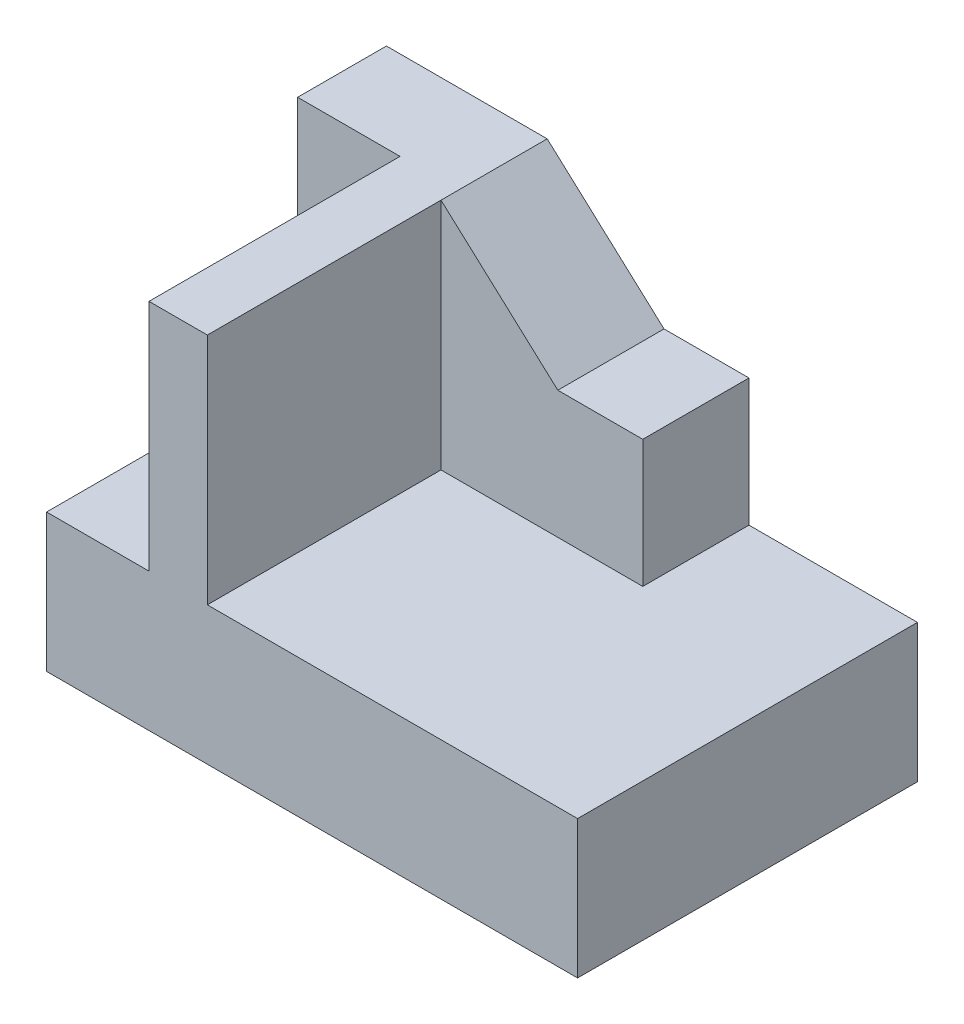
ISO-10303-21;
HEADER;
FILE_DESCRIPTION(('STEP AP214'),'2;1');
FILE_NAME('part.step','',(''),(''),'','','');
FILE_SCHEMA(('AUTOMOTIVE_DESIGN { 1 0 10303 214 1 1 1 1 }'));
ENDSEC;
DATA;
#1=APPLICATION_CONTEXT('core data for automotive mechanical design processes');
#2=APPLICATION_PROTOCOL_DEFINITION('international standard','automotive_design',2000,#1);
#3=PRODUCT_CONTEXT('',#1,'mechanical');
#4=PRODUCT('Part','Part','',(#3));
#5=PRODUCT_RELATED_PRODUCT_CATEGORY('part','',(#4));
#6=PRODUCT_DEFINITION_FORMATION('','',#4);
#7=PRODUCT_DEFINITION_CONTEXT('part definition',#1,'design');
#8=PRODUCT_DEFINITION('design','',#6,#7);
#9=PRODUCT_DEFINITION_SHAPE('','',#8);
#10=(LENGTH_UNIT() NAMED_UNIT(*) SI_UNIT(.MILLI.,.METRE.));
#11=(NAMED_UNIT(*) PLANE_ANGLE_UNIT() SI_UNIT($,.RADIAN.));
#12=(NAMED_UNIT(*) SI_UNIT($,.STERADIAN.) SOLID_ANGLE_UNIT());
#13=UNCERTAINTY_MEASURE_WITH_UNIT(LENGTH_MEASURE(1.E-05),#10,'distance_accuracy_value','');
#14=(GEOMETRIC_REPRESENTATION_CONTEXT(3) GLOBAL_UNCERTAINTY_ASSIGNED_CONTEXT((#13)) GLOBAL_UNIT_ASSIGNED_CONTEXT((#10,
#11,#12)) REPRESENTATION_CONTEXT('',''));
#15=CARTESIAN_POINT('',(0.,0.,0.));
#16=DIRECTION('',(0.,0.,1.));
#17=DIRECTION('',(1.,0.,0.));
#18=AXIS2_PLACEMENT_3D('',#15,#16,#17);
#19=CARTESIAN_POINT('',(-17.7901462739504,11.0398899587345,-32.));
#20=DIRECTION('',(0.,1.,0.));
#21=DIRECTION('',(0.,0.,1.));
#22=AXIS2_PLACEMENT_3D('',#19,#20,#21);
#23=PLANE('',#22);
#24=DIRECTION('',(0.,0.,1.));
#25=VECTOR('',#24,1.);
#26=CARTESIAN_POINT('',(-8.14624097660285,11.0398899587345,-32.));
#27=LINE('',#26,#25);
#28=CARTESIAN_POINT('',(-8.14624097660285,11.0398899587345,-23.6403306274951));
#29=VERTEX_POINT('',#28);
#30=CARTESIAN_POINT('',(-8.14624097660285,11.0398899587345,0.));
#31=VERTEX_POINT('',#30);
#32=EDGE_CURVE('E203',#29,#31,#27,.T.);
#33=ORIENTED_EDGE('',*,*,#32,.F.);
#34=DIRECTION('',(1.,0.,0.));
#35=VECTOR('',#34,1.);
#36=CARTESIAN_POINT('',(-8.14624097660285,11.0398899587345,-23.6403306274951));
#37=LINE('',#36,#35);
#38=CARTESIAN_POINT('',(-17.7901462739504,11.0398899587345,-23.6403306274951));
#39=VERTEX_POINT('',#38);
#40=EDGE_CURVE('E162',#39,#29,#37,.T.);
#41=ORIENTED_EDGE('',*,*,#40,.F.);
#42=DIRECTION('',(0.,0.,1.));
#43=VECTOR('',#42,1.);
#44=CARTESIAN_POINT('',(-17.7901462739504,11.0398899587345,-32.));
#45=LINE('',#44,#43);
#46=CARTESIAN_POINT('',(-17.7901462739504,11.0398899587345,0.));
#47=VERTEX_POINT('',#46);
#48=EDGE_CURVE('E11',#39,#47,#45,.T.);
#49=ORIENTED_EDGE('',*,*,#48,.T.);
#50=DIRECTION('',(-1.,0.,0.));
#51=VECTOR('',#50,1.);
#52=CARTESIAN_POINT('',(-17.7901462739504,11.0398899587345,0.));
#53=LINE('',#52,#51);
#54=EDGE_CURVE('E225',#31,#47,#53,.T.);
#55=ORIENTED_EDGE('',*,*,#54,.F.);
#56=EDGE_LOOP('',(#33,#41,#49,#55));
#57=FACE_BOUND('',#56,.T.);
#58=ADVANCED_FACE('F39',(#57),#23,.T.);
#59=CARTESIAN_POINT('',(-8.14624097660285,11.0398899587345,-32.));
#60=DIRECTION('',(-1.,0.,0.));
#61=DIRECTION('',(0.,0.,1.));
#62=AXIS2_PLACEMENT_3D('',#59,#60,#61);
#63=PLANE('',#62);
#64=DIRECTION('',(0.,0.,1.));
#65=VECTOR('',#64,1.);
#66=CARTESIAN_POINT('',(-8.14624097660285,33.0398899587345,-32.));
#67=LINE('',#66,#65);
#68=CARTESIAN_POINT('',(-8.14624097660285,33.0398899587345,-23.6403306274951));
#69=VERTEX_POINT('',#68);
#70=CARTESIAN_POINT('',(-8.14624097660285,33.0398899587345,0.));
#71=VERTEX_POINT('',#70);
#72=EDGE_CURVE('E206',#69,#71,#67,.T.);
#73=ORIENTED_EDGE('',*,*,#72,.F.);
#74=DIRECTION('',(0.,-1.,0.));
#75=VECTOR('',#74,1.);
#76=CARTESIAN_POINT('',(-8.14624097660285,33.0398899587345,-23.6403306274951));
#77=LINE('',#76,#75);
#78=EDGE_CURVE('E56',#69,#29,#77,.T.);
#79=ORIENTED_EDGE('',*,*,#78,.T.);
#80=ORIENTED_EDGE('',*,*,#32,.T.);
#81=DIRECTION('',(0.,-1.,0.));
#82=VECTOR('',#81,1.);
#83=CARTESIAN_POINT('',(-8.14624097660285,11.0398899587345,0.));
#84=LINE('',#83,#82);
#85=EDGE_CURVE('E156',#71,#31,#84,.T.);
#86=ORIENTED_EDGE('',*,*,#85,.F.);
#87=EDGE_LOOP('',(#73,#79,#80,#86));
#88=FACE_BOUND('',#87,.T.);
#89=ADVANCED_FACE('F244',(#88),#63,.T.);
#90=CARTESIAN_POINT('',(-17.7901462739504,11.0398899587345,-32.));
#91=DIRECTION('',(-1.,0.,0.));
#92=DIRECTION('',(0.,0.,1.));
#93=AXIS2_PLACEMENT_3D('',#90,#91,#92);
#94=PLANE('',#93);
#95=DIRECTION('',(0.,-1.,0.));
#96=VECTOR('',#95,1.);
#97=CARTESIAN_POINT('',(-17.7901462739504,11.0398899587345,0.));
#98=LINE('',#97,#96);
#99=CARTESIAN_POINT('',(-17.7901462739504,-1.96011004126553,0.));
#100=VERTEX_POINT('',#99);
#101=EDGE_CURVE('E205',#47,#100,#98,.T.);
#102=ORIENTED_EDGE('',*,*,#101,.F.);
#103=ORIENTED_EDGE('',*,*,#48,.F.);
#104=DIRECTION('',(0.,-1.,0.));
#105=VECTOR('',#104,1.);
#106=CARTESIAN_POINT('',(-17.7901462739504,33.0398899587345,-23.6403306274951));
#107=LINE('',#106,#105);
#108=CARTESIAN_POINT('',(-17.7901462739504,33.0398899587345,-23.6403306274951));
#109=VERTEX_POINT('',#108);
#110=EDGE_CURVE('E160',#109,#39,#107,.T.);
#111=ORIENTED_EDGE('',*,*,#110,.F.);
#112=DIRECTION('',(0.,0.,1.));
#113=VECTOR('',#112,1.);
#114=CARTESIAN_POINT('',(-17.7901462739504,33.0398899587345,-32.));
#115=LINE('',#114,#113);
#116=CARTESIAN_POINT('',(-17.7901462739504,33.0398899587345,-32.));
#117=VERTEX_POINT('',#116);
#118=EDGE_CURVE('E149',#117,#109,#115,.T.);
#119=ORIENTED_EDGE('',*,*,#118,.F.);
#120=DIRECTION('',(0.,-1.,0.));
#121=VECTOR('',#120,1.);
#122=CARTESIAN_POINT('',(-17.7901462739504,11.0398899587345,-32.));
#123=LINE('',#122,#121);
#124=CARTESIAN_POINT('',(-17.7901462739504,-1.96011004126553,-32.));
#125=VERTEX_POINT('',#124);
#126=EDGE_CURVE('E133',#117,#125,#123,.T.);
#127=ORIENTED_EDGE('',*,*,#126,.T.);
#128=DIRECTION('',(0.,0.,1.));
#129=VECTOR('',#128,1.);
#130=CARTESIAN_POINT('',(-17.7901462739504,-1.96011004126553,-32.));
#131=LINE('',#130,#129);
#132=EDGE_CURVE('E43',#125,#100,#131,.T.);
#133=ORIENTED_EDGE('',*,*,#132,.T.);
#134=EDGE_LOOP('',(#102,#103,#111,#119,#127,#133));
#135=FACE_BOUND('',#134,.T.);
#136=ADVANCED_FACE('F41',(#135),#94,.T.);
#137=DIRECTION('',(0.,0.,-1.));
#138=VECTOR('',#137,1.);
#139=CARTESIAN_POINT('',(16.3496244959254,11.0398899587345,-22.));
#140=LINE('',#139,#138);
#141=CARTESIAN_POINT('',(16.3496244959254,11.0398899587345,-22.));
#142=VERTEX_POINT('',#141);
#143=CARTESIAN_POINT('',(16.3496244959254,11.0398899587345,-32.));
#144=VERTEX_POINT('',#143);
#145=EDGE_CURVE('E64',#142,#144,#140,.T.);
#146=ORIENTED_EDGE('',*,*,#145,.F.);
#147=DIRECTION('',(-1.,0.,0.));
#148=VECTOR('',#147,1.);
#149=CARTESIAN_POINT('',(16.3496244959254,11.0398899587345,-22.));
#150=LINE('',#149,#148);
#151=CARTESIAN_POINT('',(-2.6503755040746,11.0398899587345,-22.));
#152=VERTEX_POINT('',#151);
#153=EDGE_CURVE('E170',#142,#152,#150,.T.);
#154=ORIENTED_EDGE('',*,*,#153,.T.);
#155=DIRECTION('',(0.,0.,1.));
#156=VECTOR('',#155,1.);
#157=CARTESIAN_POINT('',(-2.6503755040746,11.0398899587345,-32.));
#158=LINE('',#157,#156);
#159=CARTESIAN_POINT('',(-2.6503755040746,11.0398899587345,0.));
#160=VERTEX_POINT('',#159);
#161=EDGE_CURVE('E155',#152,#160,#158,.T.);
#162=ORIENTED_EDGE('',*,*,#161,.T.);
#163=CARTESIAN_POINT('',(32.2098537260496,11.0398899587345,0.));
#164=VERTEX_POINT('',#163);
#165=EDGE_CURVE('E144',#164,#160,#53,.T.);
#166=ORIENTED_EDGE('',*,*,#165,.F.);
#167=DIRECTION('',(0.,0.,1.));
#168=VECTOR('',#167,1.);
#169=CARTESIAN_POINT('',(32.2098537260496,11.0398899587345,-32.));
#170=LINE('',#169,#168);
#171=CARTESIAN_POINT('',(32.2098537260496,11.0398899587345,-32.));
#172=VERTEX_POINT('',#171);
#173=EDGE_CURVE('E48',#172,#164,#170,.T.);
#174=ORIENTED_EDGE('',*,*,#173,.F.);
#175=DIRECTION('',(-1.,0.,0.));
#176=VECTOR('',#175,1.);
#177=CARTESIAN_POINT('',(-17.7901462739504,11.0398899587345,-32.));
#178=LINE('',#177,#176);
#179=EDGE_CURVE('E215',#172,#144,#178,.T.);
#180=ORIENTED_EDGE('',*,*,#179,.T.);
#181=EDGE_LOOP('',(#146,#154,#162,#166,#174,#180));
#182=FACE_BOUND('',#181,.T.);
#183=ADVANCED_FACE('F276',(#182),#23,.T.);
#184=CARTESIAN_POINT('',(32.2098537260496,11.0398899587345,-32.));
#185=DIRECTION('',(1.,0.,0.));
#186=DIRECTION('',(0.,0.,-1.));
#187=AXIS2_PLACEMENT_3D('',#184,#185,#186);
#188=PLANE('',#187);
#189=DIRECTION('',(0.,1.,0.));
#190=VECTOR('',#189,1.);
#191=CARTESIAN_POINT('',(32.2098537260496,11.0398899587345,0.));
#192=LINE('',#191,#190);
#193=CARTESIAN_POINT('',(32.2098537260496,-1.96011004126553,0.));
#194=VERTEX_POINT('',#193);
#195=EDGE_CURVE('E222',#194,#164,#192,.T.);
#196=ORIENTED_EDGE('',*,*,#195,.F.);
#197=DIRECTION('',(0.,0.,1.));
#198=VECTOR('',#197,1.);
#199=CARTESIAN_POINT('',(32.2098537260496,-1.96011004126553,-32.));
#200=LINE('',#199,#198);
#201=CARTESIAN_POINT('',(32.2098537260496,-1.96011004126553,-32.));
#202=VERTEX_POINT('',#201);
#203=EDGE_CURVE('E228',#202,#194,#200,.T.);
#204=ORIENTED_EDGE('',*,*,#203,.F.);
#205=DIRECTION('',(0.,1.,0.));
#206=VECTOR('',#205,1.);
#207=CARTESIAN_POINT('',(32.2098537260496,11.0398899587345,-32.));
#208=LINE('',#207,#206);
#209=EDGE_CURVE('E212',#202,#172,#208,.T.);
#210=ORIENTED_EDGE('',*,*,#209,.T.);
#211=ORIENTED_EDGE('',*,*,#173,.T.);
#212=EDGE_LOOP('',(#196,#204,#210,#211));
#213=FACE_BOUND('',#212,.T.);
#214=ADVANCED_FACE('F284',(#213),#188,.T.);
#215=CARTESIAN_POINT('',(-17.7901462739504,-1.96011004126553,-32.));
#216=DIRECTION('',(0.,-1.,0.));
#217=DIRECTION('',(0.,0.,-1.));
#218=AXIS2_PLACEMENT_3D('',#215,#216,#217);
#219=PLANE('',#218);
#220=DIRECTION('',(1.,0.,0.));
#221=VECTOR('',#220,1.);
#222=CARTESIAN_POINT('',(-17.7901462739504,-1.96011004126553,0.));
#223=LINE('',#222,#221);
#224=EDGE_CURVE('E219',#100,#194,#223,.T.);
#225=ORIENTED_EDGE('',*,*,#224,.F.);
#226=ORIENTED_EDGE('',*,*,#132,.F.);
#227=DIRECTION('',(1.,0.,0.));
#228=VECTOR('',#227,1.);
#229=CARTESIAN_POINT('',(-17.7901462739504,-1.96011004126553,-32.));
#230=LINE('',#229,#228);
#231=EDGE_CURVE('E141',#125,#202,#230,.T.);
#232=ORIENTED_EDGE('',*,*,#231,.T.);
#233=ORIENTED_EDGE('',*,*,#203,.T.);
#234=EDGE_LOOP('',(#225,#226,#232,#233));
#235=FACE_BOUND('',#234,.T.);
#236=ADVANCED_FACE('F232',(#235),#219,.T.);
#237=CARTESIAN_POINT('',(0.,0.,-32.));
#238=DIRECTION('',(0.,0.,1.));
#239=DIRECTION('',(1.,0.,0.));
#240=AXIS2_PLACEMENT_3D('',#237,#238,#239);
#241=PLANE('',#240);
#242=ORIENTED_EDGE('',*,*,#126,.F.);
#243=DIRECTION('',(-1.,0.,0.));
#244=VECTOR('',#243,1.);
#245=CARTESIAN_POINT('',(-8.14624097660285,33.0398899587345,-32.));
#246=LINE('',#245,#244);
#247=CARTESIAN_POINT('',(-2.6503755040746,33.0398899587345,-32.));
#248=VERTEX_POINT('',#247);
#249=EDGE_CURVE('E137',#248,#117,#246,.T.);
#250=ORIENTED_EDGE('',*,*,#249,.F.);
#251=DIRECTION('',(0.739940073395944,-0.672672793996312,0.));
#252=VECTOR('',#251,1.);
#253=CARTESIAN_POINT('',(8.3496244959254,23.0398899587345,-32.));
#254=LINE('',#253,#252);
#255=CARTESIAN_POINT('',(8.3496244959254,23.0398899587345,-32.));
#256=VERTEX_POINT('',#255);
#257=EDGE_CURVE('E169',#248,#256,#254,.T.);
#258=ORIENTED_EDGE('',*,*,#257,.T.);
#259=DIRECTION('',(1.,0.,0.));
#260=VECTOR('',#259,1.);
#261=CARTESIAN_POINT('',(16.3496244959254,23.0398899587345,-32.));
#262=LINE('',#261,#260);
#263=CARTESIAN_POINT('',(16.3496244959254,23.0398899587345,-32.));
#264=VERTEX_POINT('',#263);
#265=EDGE_CURVE('E186',#256,#264,#262,.T.);
#266=ORIENTED_EDGE('',*,*,#265,.T.);
#267=DIRECTION('',(0.,-1.,0.));
#268=VECTOR('',#267,1.);
#269=CARTESIAN_POINT('',(16.3496244959254,11.0398899587345,-32.));
#270=LINE('',#269,#268);
#271=EDGE_CURVE('E173',#264,#144,#270,.T.);
#272=ORIENTED_EDGE('',*,*,#271,.T.);
#273=ORIENTED_EDGE('',*,*,#179,.F.);
#274=ORIENTED_EDGE('',*,*,#209,.F.);
#275=ORIENTED_EDGE('',*,*,#231,.F.);
#276=EDGE_LOOP('',(#242,#250,#258,#266,#272,#273,#274,#275));
#277=FACE_BOUND('',#276,.T.);
#278=ADVANCED_FACE('F135',(#277),#241,.F.);
#279=CARTESIAN_POINT('',(0.,0.,0.));
#280=DIRECTION('',(0.,0.,1.));
#281=DIRECTION('',(1.,0.,0.));
#282=AXIS2_PLACEMENT_3D('',#279,#280,#281);
#283=PLANE('',#282);
#284=ORIENTED_EDGE('',*,*,#101,.T.);
#285=ORIENTED_EDGE('',*,*,#224,.T.);
#286=ORIENTED_EDGE('',*,*,#195,.T.);
#287=ORIENTED_EDGE('',*,*,#165,.T.);
#288=DIRECTION('',(0.,1.,0.));
#289=VECTOR('',#288,1.);
#290=CARTESIAN_POINT('',(-2.6503755040746,33.0398899587345,0.));
#291=LINE('',#290,#289);
#292=CARTESIAN_POINT('',(-2.6503755040746,33.0398899587345,0.));
#293=VERTEX_POINT('',#292);
#294=EDGE_CURVE('E192',#160,#293,#291,.T.);
#295=ORIENTED_EDGE('',*,*,#294,.T.);
#296=DIRECTION('',(-1.,0.,0.));
#297=VECTOR('',#296,1.);
#298=CARTESIAN_POINT('',(-8.14624097660285,33.0398899587345,0.));
#299=LINE('',#298,#297);
#300=EDGE_CURVE('E198',#293,#71,#299,.T.);
#301=ORIENTED_EDGE('',*,*,#300,.T.);
#302=ORIENTED_EDGE('',*,*,#85,.T.);
#303=ORIENTED_EDGE('',*,*,#54,.T.);
#304=EDGE_LOOP('',(#284,#285,#286,#287,#295,#301,#302,#303));
#305=FACE_BOUND('',#304,.T.);
#306=ADVANCED_FACE('F235',(#305),#283,.T.);
#307=CARTESIAN_POINT('',(-8.14624097660285,33.0398899587345,-32.));
#308=DIRECTION('',(0.,1.,0.));
#309=DIRECTION('',(0.,0.,1.));
#310=AXIS2_PLACEMENT_3D('',#307,#308,#309);
#311=PLANE('',#310);
#312=ORIENTED_EDGE('',*,*,#300,.F.);
#313=DIRECTION('',(0.,0.,1.));
#314=VECTOR('',#313,1.);
#315=CARTESIAN_POINT('',(-2.6503755040746,33.0398899587345,-32.));
#316=LINE('',#315,#314);
#317=CARTESIAN_POINT('',(-2.6503755040746,33.0398899587345,-22.));
#318=VERTEX_POINT('',#317);
#319=EDGE_CURVE('E209',#318,#293,#316,.T.);
#320=ORIENTED_EDGE('',*,*,#319,.F.);
#321=EDGE_CURVE('E153',#248,#318,#316,.T.);
#322=ORIENTED_EDGE('',*,*,#321,.F.);
#323=ORIENTED_EDGE('',*,*,#249,.T.);
#324=ORIENTED_EDGE('',*,*,#118,.T.);
#325=DIRECTION('',(1.,0.,0.));
#326=VECTOR('',#325,1.);
#327=CARTESIAN_POINT('',(-8.14624097660285,33.0398899587345,-23.6403306274951));
#328=LINE('',#327,#326);
#329=EDGE_CURVE('E161',#109,#69,#328,.T.);
#330=ORIENTED_EDGE('',*,*,#329,.T.);
#331=ORIENTED_EDGE('',*,*,#72,.T.);
#332=EDGE_LOOP('',(#312,#320,#322,#323,#324,#330,#331));
#333=FACE_BOUND('',#332,.T.);
#334=ADVANCED_FACE('F148',(#333),#311,.T.);
#335=CARTESIAN_POINT('',(-2.6503755040746,33.0398899587345,-32.));
#336=DIRECTION('',(1.,0.,0.));
#337=DIRECTION('',(0.,1.,0.));
#338=AXIS2_PLACEMENT_3D('',#335,#336,#337);
#339=PLANE('',#338);
#340=DIRECTION('',(0.,1.,0.));
#341=VECTOR('',#340,1.);
#342=CARTESIAN_POINT('',(-2.6503755040746,33.0398899587345,-22.));
#343=LINE('',#342,#341);
#344=EDGE_CURVE('E172',#152,#318,#343,.T.);
#345=ORIENTED_EDGE('',*,*,#344,.T.);
#346=ORIENTED_EDGE('',*,*,#319,.T.);
#347=ORIENTED_EDGE('',*,*,#294,.F.);
#348=ORIENTED_EDGE('',*,*,#161,.F.);
#349=EDGE_LOOP('',(#345,#346,#347,#348));
#350=FACE_BOUND('',#349,.T.);
#351=ADVANCED_FACE('F249',(#350),#339,.T.);
#352=CARTESIAN_POINT('',(16.3496244959254,11.0398899587345,-22.));
#353=DIRECTION('',(1.,0.,0.));
#354=DIRECTION('',(0.,0.,-1.));
#355=AXIS2_PLACEMENT_3D('',#352,#353,#354);
#356=PLANE('',#355);
#357=ORIENTED_EDGE('',*,*,#271,.F.);
#358=DIRECTION('',(0.,0.,-1.));
#359=VECTOR('',#358,1.);
#360=CARTESIAN_POINT('',(16.3496244959254,23.0398899587345,-22.));
#361=LINE('',#360,#359);
#362=CARTESIAN_POINT('',(16.3496244959254,23.0398899587345,-22.));
#363=VERTEX_POINT('',#362);
#364=EDGE_CURVE('E193',#363,#264,#361,.T.);
#365=ORIENTED_EDGE('',*,*,#364,.F.);
#366=DIRECTION('',(0.,-1.,0.));
#367=VECTOR('',#366,1.);
#368=CARTESIAN_POINT('',(16.3496244959254,11.0398899587345,-22.));
#369=LINE('',#368,#367);
#370=EDGE_CURVE('E181',#363,#142,#369,.T.);
#371=ORIENTED_EDGE('',*,*,#370,.T.);
#372=ORIENTED_EDGE('',*,*,#145,.T.);
#373=EDGE_LOOP('',(#357,#365,#371,#372));
#374=FACE_BOUND('',#373,.T.);
#375=ADVANCED_FACE('F264',(#374),#356,.T.);
#376=CARTESIAN_POINT('',(16.3496244959254,23.0398899587345,-22.));
#377=DIRECTION('',(0.,1.,0.));
#378=DIRECTION('',(0.,0.,1.));
#379=AXIS2_PLACEMENT_3D('',#376,#377,#378);
#380=PLANE('',#379);
#381=ORIENTED_EDGE('',*,*,#265,.F.);
#382=DIRECTION('',(0.,0.,-1.));
#383=VECTOR('',#382,1.);
#384=CARTESIAN_POINT('',(8.3496244959254,23.0398899587345,-22.));
#385=LINE('',#384,#383);
#386=CARTESIAN_POINT('',(8.3496244959254,23.0398899587345,-22.));
#387=VERTEX_POINT('',#386);
#388=EDGE_CURVE('E184',#387,#256,#385,.T.);
#389=ORIENTED_EDGE('',*,*,#388,.F.);
#390=DIRECTION('',(1.,0.,0.));
#391=VECTOR('',#390,1.);
#392=CARTESIAN_POINT('',(16.3496244959254,23.0398899587345,-22.));
#393=LINE('',#392,#391);
#394=EDGE_CURVE('E178',#387,#363,#393,.T.);
#395=ORIENTED_EDGE('',*,*,#394,.T.);
#396=ORIENTED_EDGE('',*,*,#364,.T.);
#397=EDGE_LOOP('',(#381,#389,#395,#396));
#398=FACE_BOUND('',#397,.T.);
#399=ADVANCED_FACE('F260',(#398),#380,.T.);
#400=CARTESIAN_POINT('',(8.3496244959254,23.0398899587345,-22.));
#401=DIRECTION('',(0.672672793996312,0.739940073395944,0.));
#402=DIRECTION('',(-0.739940073395944,0.672672793996312,0.));
#403=AXIS2_PLACEMENT_3D('',#400,#401,#402);
#404=PLANE('',#403);
#405=ORIENTED_EDGE('',*,*,#257,.F.);
#406=ORIENTED_EDGE('',*,*,#321,.T.);
#407=DIRECTION('',(0.739940073395944,-0.672672793996312,0.));
#408=VECTOR('',#407,1.);
#409=CARTESIAN_POINT('',(8.3496244959254,23.0398899587345,-22.));
#410=LINE('',#409,#408);
#411=EDGE_CURVE('E175',#318,#387,#410,.T.);
#412=ORIENTED_EDGE('',*,*,#411,.T.);
#413=ORIENTED_EDGE('',*,*,#388,.T.);
#414=EDGE_LOOP('',(#405,#406,#412,#413));
#415=FACE_BOUND('',#414,.T.);
#416=ADVANCED_FACE('F253',(#415),#404,.T.);
#417=CARTESIAN_POINT('',(0.,0.,-22.));
#418=DIRECTION('',(0.,0.,1.));
#419=DIRECTION('',(1.,0.,0.));
#420=AXIS2_PLACEMENT_3D('',#417,#418,#419);
#421=PLANE('',#420);
#422=ORIENTED_EDGE('',*,*,#153,.F.);
#423=ORIENTED_EDGE('',*,*,#370,.F.);
#424=ORIENTED_EDGE('',*,*,#394,.F.);
#425=ORIENTED_EDGE('',*,*,#411,.F.);
#426=ORIENTED_EDGE('',*,*,#344,.F.);
#427=EDGE_LOOP('',(#422,#423,#424,#425,#426));
#428=FACE_BOUND('',#427,.T.);
#429=ADVANCED_FACE('F256',(#428),#421,.T.);
#430=CARTESIAN_POINT('',(-8.14624097660285,33.0398899587345,-23.6403306274951));
#431=DIRECTION('',(0.,0.,-1.));
#432=DIRECTION('',(-1.,0.,0.));
#433=AXIS2_PLACEMENT_3D('',#430,#431,#432);
#434=PLANE('',#433);
#435=ORIENTED_EDGE('',*,*,#40,.T.);
#436=ORIENTED_EDGE('',*,*,#78,.F.);
#437=ORIENTED_EDGE('',*,*,#329,.F.);
#438=ORIENTED_EDGE('',*,*,#110,.T.);
#439=EDGE_LOOP('',(#435,#436,#437,#438));
#440=FACE_BOUND('',#439,.T.);
#441=ADVANCED_FACE('F241',(#440),#434,.F.);
#442=CLOSED_SHELL('',(#58,#89,#136,#183,#214,#236,#278,#306,#334,#351,#375,#399,#416,#429,#441));
#443=MANIFOLD_SOLID_BREP('B2',#442);
#444=ADVANCED_BREP_SHAPE_REPRESENTATION('',(#18,#443),#14);
#445=SHAPE_DEFINITION_REPRESENTATION(#9,#444);
ENDSEC;
END-ISO-10303-21;
